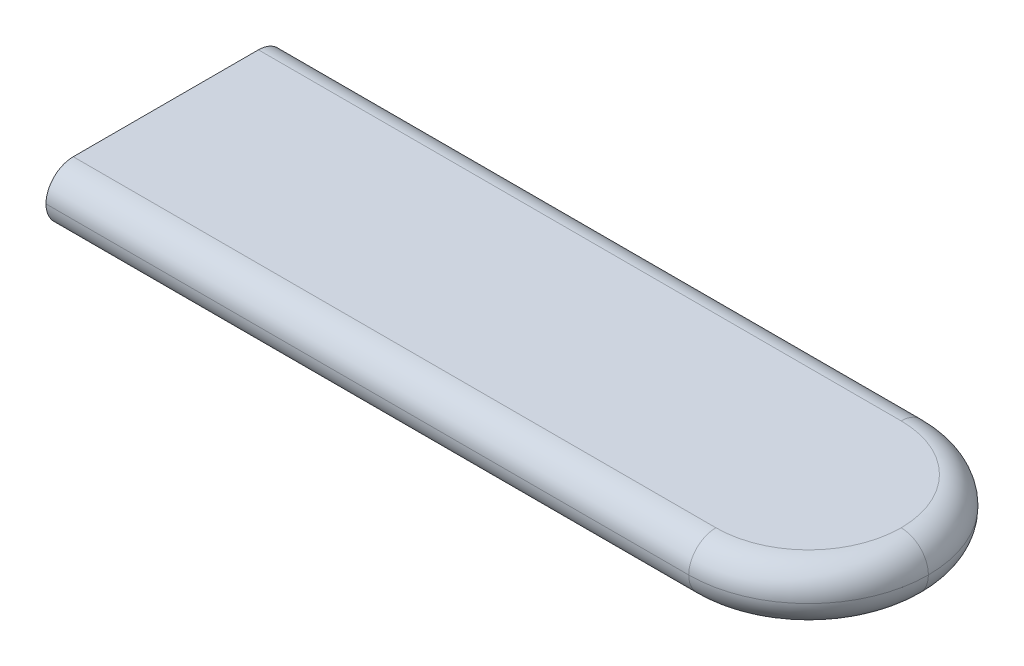
ISO-10303-21;
HEADER;
FILE_DESCRIPTION(('STEP AP214'),'2;1');
FILE_NAME('part.step','',(''),(''),'','','');
FILE_SCHEMA(('AUTOMOTIVE_DESIGN { 1 0 10303 214 1 1 1 1 }'));
ENDSEC;
DATA;
#1=APPLICATION_CONTEXT('core data for automotive mechanical design processes');
#2=APPLICATION_PROTOCOL_DEFINITION('international standard','automotive_design',2000,#1);
#3=PRODUCT_CONTEXT('',#1,'mechanical');
#4=PRODUCT('Part','Part','',(#3));
#5=PRODUCT_RELATED_PRODUCT_CATEGORY('part','',(#4));
#6=PRODUCT_DEFINITION_FORMATION('','',#4);
#7=PRODUCT_DEFINITION_CONTEXT('part definition',#1,'design');
#8=PRODUCT_DEFINITION('design','',#6,#7);
#9=PRODUCT_DEFINITION_SHAPE('','',#8);
#10=(LENGTH_UNIT() NAMED_UNIT(*) SI_UNIT(.MILLI.,.METRE.));
#11=(NAMED_UNIT(*) PLANE_ANGLE_UNIT() SI_UNIT($,.RADIAN.));
#12=(NAMED_UNIT(*) SI_UNIT($,.STERADIAN.) SOLID_ANGLE_UNIT());
#13=UNCERTAINTY_MEASURE_WITH_UNIT(LENGTH_MEASURE(1.E-05),#10,'distance_accuracy_value','');
#14=(GEOMETRIC_REPRESENTATION_CONTEXT(3) GLOBAL_UNCERTAINTY_ASSIGNED_CONTEXT((#13)) GLOBAL_UNIT_ASSIGNED_CONTEXT((#10,
#11,#12)) REPRESENTATION_CONTEXT('',''));
#15=CARTESIAN_POINT('',(0.,0.,0.));
#16=DIRECTION('',(0.,0.,1.));
#17=DIRECTION('',(1.,0.,0.));
#18=AXIS2_PLACEMENT_3D('',#15,#16,#17);
#19=CARTESIAN_POINT('',(40.0930117335328,65.2433443998356,62.6271242589919));
#20=DIRECTION('',(1.,0.,0.));
#21=DIRECTION('',(0.,1.,0.));
#22=AXIS2_PLACEMENT_3D('',#19,#20,#21);
#23=CYLINDRICAL_SURFACE('',#22,2.5);
#24=CARTESIAN_POINT('',(40.0930117335328,65.2433443998356,62.6271242589919));
#25=DIRECTION('',(-1.,0.,0.));
#26=DIRECTION('',(0.,0.,-1.));
#27=AXIS2_PLACEMENT_3D('',#24,#25,#26);
#28=CIRCLE('',#27,2.5);
#29=CARTESIAN_POINT('',(40.0930117335328,62.7433443998355,62.6271242589919));
#30=VERTEX_POINT('',#29);
#31=CARTESIAN_POINT('',(40.0930117335328,65.2433443998356,65.1271242589919));
#32=VERTEX_POINT('',#31);
#33=EDGE_CURVE('E207',#30,#32,#28,.T.);
#34=ORIENTED_EDGE('',*,*,#33,.F.);
#35=DIRECTION('',(-1.,0.,0.));
#36=VECTOR('',#35,1.);
#37=CARTESIAN_POINT('',(99.0930117335328,62.7433443998355,62.6271242589919));
#38=LINE('',#37,#36);
#39=CARTESIAN_POINT('',(99.0930117335328,62.7433443998355,62.6271242589919));
#40=VERTEX_POINT('',#39);
#41=EDGE_CURVE('E265',#40,#30,#38,.T.);
#42=ORIENTED_EDGE('',*,*,#41,.F.);
#43=CARTESIAN_POINT('',(99.0930117335328,65.2433443998356,62.6271242589919));
#44=DIRECTION('',(-1.,0.,0.));
#45=DIRECTION('',(0.,1.,0.));
#46=AXIS2_PLACEMENT_3D('',#43,#44,#45);
#47=CIRCLE('',#46,2.5);
#48=CARTESIAN_POINT('',(99.0930117335328,65.2433443998356,65.1271242589919));
#49=VERTEX_POINT('',#48);
#50=EDGE_CURVE('E322',#40,#49,#47,.T.);
#51=ORIENTED_EDGE('',*,*,#50,.T.);
#52=DIRECTION('',(-1.,0.,0.));
#53=VECTOR('',#52,1.);
#54=CARTESIAN_POINT('',(40.0930117335328,65.2433443998356,65.1271242589919));
#55=LINE('',#54,#53);
#56=EDGE_CURVE('E11',#49,#32,#55,.T.);
#57=ORIENTED_EDGE('',*,*,#56,.T.);
#58=EDGE_LOOP('',(#34,#42,#51,#57));
#59=FACE_BOUND('',#58,.T.);
#60=ADVANCED_FACE('F16',(#59),#23,.T.);
#61=CARTESIAN_POINT('',(99.0930117335328,65.2433443998356,54.1271242589919));
#62=DIRECTION('',(0.,1.,0.));
#63=DIRECTION('',(-1.,0.,0.));
#64=AXIS2_PLACEMENT_3D('',#61,#62,#63);
#65=TOROIDAL_SURFACE('',#64,8.5,2.5);
#66=CARTESIAN_POINT('',(107.593011733533,65.2433443998356,54.1271242589919));
#67=DIRECTION('',(0.,0.,1.));
#68=DIRECTION('',(0.,-1.,0.));
#69=AXIS2_PLACEMENT_3D('',#66,#67,#68);
#70=CIRCLE('',#69,2.5);
#71=CARTESIAN_POINT('',(107.593011733533,62.7433443998355,54.1271242589919));
#72=VERTEX_POINT('',#71);
#73=CARTESIAN_POINT('',(110.093011733533,65.2433443998356,54.1271242589919));
#74=VERTEX_POINT('',#73);
#75=EDGE_CURVE('E311',#72,#74,#70,.T.);
#76=ORIENTED_EDGE('',*,*,#75,.F.);
#77=CARTESIAN_POINT('',(99.0930117335328,62.7433443998355,54.1271242589919));
#78=DIRECTION('',(0.,-1.,0.));
#79=DIRECTION('',(1.,0.,0.));
#80=AXIS2_PLACEMENT_3D('',#77,#78,#79);
#81=CIRCLE('',#80,8.5);
#82=CARTESIAN_POINT('',(99.0930117335328,62.7433443998355,45.6271242589919));
#83=VERTEX_POINT('',#82);
#84=EDGE_CURVE('E262',#83,#72,#81,.T.);
#85=ORIENTED_EDGE('',*,*,#84,.F.);
#86=CARTESIAN_POINT('',(99.0930117335328,65.2433443998356,45.6271242589919));
#87=DIRECTION('',(1.,0.,0.));
#88=DIRECTION('',(0.,-1.,0.));
#89=AXIS2_PLACEMENT_3D('',#86,#87,#88);
#90=CIRCLE('',#89,2.5);
#91=CARTESIAN_POINT('',(99.0930117335328,65.2433443998356,43.127124258992));
#92=VERTEX_POINT('',#91);
#93=EDGE_CURVE('E24',#83,#92,#90,.T.);
#94=ORIENTED_EDGE('',*,*,#93,.T.);
#95=CARTESIAN_POINT('',(99.0930117335328,65.2433443998356,54.1271242589919));
#96=DIRECTION('',(0.,-1.,0.));
#97=DIRECTION('',(1.,0.,0.));
#98=AXIS2_PLACEMENT_3D('',#95,#96,#97);
#99=CIRCLE('',#98,11.);
#100=EDGE_CURVE('E219',#92,#74,#99,.T.);
#101=ORIENTED_EDGE('',*,*,#100,.T.);
#102=EDGE_LOOP('',(#76,#85,#94,#101));
#103=FACE_BOUND('',#102,.T.);
#104=ADVANCED_FACE('F309',(#103),#65,.T.);
#105=CARTESIAN_POINT('',(99.0930117335328,65.2433443998356,62.6271242589919));
#106=DIRECTION('',(-1.,0.,0.));
#107=DIRECTION('',(0.,-1.,0.));
#108=AXIS2_PLACEMENT_3D('',#105,#106,#107);
#109=CYLINDRICAL_SURFACE('',#108,2.5);
#110=DIRECTION('',(1.,0.,0.));
#111=VECTOR('',#110,1.);
#112=CARTESIAN_POINT('',(99.0930117335328,67.7433443998356,62.6271242589919));
#113=LINE('',#112,#111);
#114=CARTESIAN_POINT('',(40.0930117335328,67.7433443998356,62.6271242589919));
#115=VERTEX_POINT('',#114);
#116=CARTESIAN_POINT('',(99.0930117335328,67.7433443998356,62.6271242589919));
#117=VERTEX_POINT('',#116);
#118=EDGE_CURVE('E252',#115,#117,#113,.T.);
#119=ORIENTED_EDGE('',*,*,#118,.F.);
#120=CARTESIAN_POINT('',(40.0930117335328,65.2433443998356,62.6271242589919));
#121=DIRECTION('',(-1.,0.,0.));
#122=DIRECTION('',(0.,0.,-1.));
#123=AXIS2_PLACEMENT_3D('',#120,#121,#122);
#124=CIRCLE('',#123,2.5);
#125=EDGE_CURVE('E212',#32,#115,#124,.T.);
#126=ORIENTED_EDGE('',*,*,#125,.F.);
#127=ORIENTED_EDGE('',*,*,#56,.F.);
#128=CARTESIAN_POINT('',(99.0930117335328,65.2433443998356,62.6271242589919));
#129=DIRECTION('',(-1.,0.,0.));
#130=DIRECTION('',(0.,1.,0.));
#131=AXIS2_PLACEMENT_3D('',#128,#129,#130);
#132=CIRCLE('',#131,2.5);
#133=EDGE_CURVE('E186',#49,#117,#132,.T.);
#134=ORIENTED_EDGE('',*,*,#133,.T.);
#135=EDGE_LOOP('',(#119,#126,#127,#134));
#136=FACE_BOUND('',#135,.T.);
#137=ADVANCED_FACE('F357',(#136),#109,.T.);
#138=CARTESIAN_POINT('',(40.0930117335328,65.2433443998356,45.6271242589919));
#139=DIRECTION('',(-1.,0.,0.));
#140=DIRECTION('',(0.,-1.,0.));
#141=AXIS2_PLACEMENT_3D('',#138,#139,#140);
#142=CYLINDRICAL_SURFACE('',#141,2.5);
#143=CARTESIAN_POINT('',(40.0930117335328,65.2433443998356,45.6271242589919));
#144=DIRECTION('',(-1.,0.,0.));
#145=DIRECTION('',(0.,0.,-1.));
#146=AXIS2_PLACEMENT_3D('',#143,#144,#145);
#147=CIRCLE('',#146,2.5);
#148=CARTESIAN_POINT('',(40.0930117335328,65.2433443998356,43.127124258992));
#149=VERTEX_POINT('',#148);
#150=CARTESIAN_POINT('',(40.0930117335328,62.7433443998355,45.6271242589919));
#151=VERTEX_POINT('',#150);
#152=EDGE_CURVE('E227',#149,#151,#147,.T.);
#153=ORIENTED_EDGE('',*,*,#152,.F.);
#154=DIRECTION('',(1.,0.,0.));
#155=VECTOR('',#154,1.);
#156=CARTESIAN_POINT('',(99.0930117335328,65.2433443998356,43.127124258992));
#157=LINE('',#156,#155);
#158=EDGE_CURVE('E302',#149,#92,#157,.T.);
#159=ORIENTED_EDGE('',*,*,#158,.T.);
#160=ORIENTED_EDGE('',*,*,#93,.F.);
#161=DIRECTION('',(1.,0.,0.));
#162=VECTOR('',#161,1.);
#163=CARTESIAN_POINT('',(99.0930117335328,62.7433443998355,45.6271242589919));
#164=LINE('',#163,#162);
#165=EDGE_CURVE('E268',#151,#83,#164,.T.);
#166=ORIENTED_EDGE('',*,*,#165,.F.);
#167=EDGE_LOOP('',(#153,#159,#160,#166));
#168=FACE_BOUND('',#167,.T.);
#169=ADVANCED_FACE('F365',(#168),#142,.T.);
#170=CARTESIAN_POINT('',(99.0930117335328,65.2433443998356,54.1271242589919));
#171=DIRECTION('',(0.,1.,0.));
#172=DIRECTION('',(-1.,0.,0.));
#173=AXIS2_PLACEMENT_3D('',#170,#171,#172);
#174=TOROIDAL_SURFACE('',#173,8.5,2.5);
#175=CARTESIAN_POINT('',(107.593011733533,65.2433443998356,54.1271242589919));
#176=DIRECTION('',(0.,0.,1.));
#177=DIRECTION('',(0.,-1.,0.));
#178=AXIS2_PLACEMENT_3D('',#175,#176,#177);
#179=CIRCLE('',#178,2.5);
#180=CARTESIAN_POINT('',(107.593011733533,67.7433443998356,54.1271242589919));
#181=VERTEX_POINT('',#180);
#182=EDGE_CURVE('E315',#74,#181,#179,.T.);
#183=ORIENTED_EDGE('',*,*,#182,.F.);
#184=ORIENTED_EDGE('',*,*,#100,.F.);
#185=CARTESIAN_POINT('',(99.0930117335328,65.2433443998356,45.6271242589919));
#186=DIRECTION('',(1.,0.,0.));
#187=DIRECTION('',(0.,-1.,0.));
#188=AXIS2_PLACEMENT_3D('',#185,#186,#187);
#189=CIRCLE('',#188,2.5);
#190=CARTESIAN_POINT('',(99.0930117335328,67.7433443998356,45.6271242589919));
#191=VERTEX_POINT('',#190);
#192=EDGE_CURVE('E299',#92,#191,#189,.T.);
#193=ORIENTED_EDGE('',*,*,#192,.T.);
#194=CARTESIAN_POINT('',(99.0930117335328,67.7433443998356,54.1271242589919));
#195=DIRECTION('',(0.,1.,0.));
#196=DIRECTION('',(1.,0.,0.));
#197=AXIS2_PLACEMENT_3D('',#194,#195,#196);
#198=CIRCLE('',#197,8.5);
#199=EDGE_CURVE('E255',#181,#191,#198,.T.);
#200=ORIENTED_EDGE('',*,*,#199,.F.);
#201=EDGE_LOOP('',(#183,#184,#193,#200));
#202=FACE_BOUND('',#201,.T.);
#203=ADVANCED_FACE('F317',(#202),#174,.T.);
#204=CARTESIAN_POINT('',(99.0930117335328,65.2433443998356,45.6271242589919));
#205=DIRECTION('',(1.,0.,0.));
#206=DIRECTION('',(0.,1.,0.));
#207=AXIS2_PLACEMENT_3D('',#204,#205,#206);
#208=CYLINDRICAL_SURFACE('',#207,2.5);
#209=CARTESIAN_POINT('',(40.0930117335328,65.2433443998356,45.6271242589919));
#210=DIRECTION('',(-1.,0.,0.));
#211=DIRECTION('',(0.,0.,-1.));
#212=AXIS2_PLACEMENT_3D('',#209,#210,#211);
#213=CIRCLE('',#212,2.5);
#214=CARTESIAN_POINT('',(40.0930117335328,67.7433443998356,45.6271242589919));
#215=VERTEX_POINT('',#214);
#216=EDGE_CURVE('E223',#215,#149,#213,.T.);
#217=ORIENTED_EDGE('',*,*,#216,.F.);
#218=DIRECTION('',(-1.,0.,0.));
#219=VECTOR('',#218,1.);
#220=CARTESIAN_POINT('',(40.0930117335328,67.7433443998356,45.6271242589919));
#221=LINE('',#220,#219);
#222=EDGE_CURVE('E259',#191,#215,#221,.T.);
#223=ORIENTED_EDGE('',*,*,#222,.F.);
#224=ORIENTED_EDGE('',*,*,#192,.F.);
#225=ORIENTED_EDGE('',*,*,#158,.F.);
#226=EDGE_LOOP('',(#217,#223,#224,#225));
#227=FACE_BOUND('',#226,.T.);
#228=ADVANCED_FACE('F371',(#227),#208,.T.);
#229=CARTESIAN_POINT('',(99.0930117335328,65.2433443998356,45.6271242589919));
#230=DIRECTION('',(-1.,0.,0.));
#231=DIRECTION('',(0.,-1.,0.));
#232=AXIS2_PLACEMENT_3D('',#229,#230,#231);
#233=CYLINDRICAL_SURFACE('',#232,1.5);
#234=CARTESIAN_POINT('',(99.0930117335328,65.2433443998356,45.6271242589919));
#235=DIRECTION('',(1.,0.,0.));
#236=DIRECTION('',(0.,-1.,0.));
#237=AXIS2_PLACEMENT_3D('',#234,#235,#236);
#238=CIRCLE('',#237,1.5);
#239=CARTESIAN_POINT('',(99.0930117335328,63.7433443998356,45.6271242589919));
#240=VERTEX_POINT('',#239);
#241=CARTESIAN_POINT('',(99.0930117335328,65.2433443998356,44.1271242589919));
#242=VERTEX_POINT('',#241);
#243=EDGE_CURVE('E159',#240,#242,#238,.T.);
#244=ORIENTED_EDGE('',*,*,#243,.T.);
#245=DIRECTION('',(-1.,0.,0.));
#246=VECTOR('',#245,1.);
#247=CARTESIAN_POINT('',(40.0930117335328,65.2433443998356,44.1271242589919));
#248=LINE('',#247,#246);
#249=CARTESIAN_POINT('',(40.0930117335328,65.2433443998356,44.1271242589919));
#250=VERTEX_POINT('',#249);
#251=EDGE_CURVE('E296',#242,#250,#248,.T.);
#252=ORIENTED_EDGE('',*,*,#251,.T.);
#253=CARTESIAN_POINT('',(40.0930117335328,65.2433443998356,45.6271242589919));
#254=DIRECTION('',(1.,0.,0.));
#255=DIRECTION('',(0.,0.,-1.));
#256=AXIS2_PLACEMENT_3D('',#253,#254,#255);
#257=CIRCLE('',#256,1.5);
#258=CARTESIAN_POINT('',(40.0930117335328,63.7433443998356,45.6271242589919));
#259=VERTEX_POINT('',#258);
#260=EDGE_CURVE('E162',#259,#250,#257,.T.);
#261=ORIENTED_EDGE('',*,*,#260,.F.);
#262=DIRECTION('',(-1.,0.,0.));
#263=VECTOR('',#262,1.);
#264=CARTESIAN_POINT('',(99.0930117335328,63.7433443998356,45.6271242589919));
#265=LINE('',#264,#263);
#266=EDGE_CURVE('E156',#240,#259,#265,.T.);
#267=ORIENTED_EDGE('',*,*,#266,.F.);
#268=EDGE_LOOP('',(#244,#252,#261,#267));
#269=FACE_BOUND('',#268,.T.);
#270=ADVANCED_FACE('F158',(#269),#233,.F.);
#271=CARTESIAN_POINT('',(99.0930117335328,65.2433443998356,54.1271242589919));
#272=DIRECTION('',(0.,1.,0.));
#273=DIRECTION('',(-1.,0.,0.));
#274=AXIS2_PLACEMENT_3D('',#271,#272,#273);
#275=TOROIDAL_SURFACE('',#274,8.5,1.5);
#276=CARTESIAN_POINT('',(107.593011733533,65.2433443998356,54.1271242589919));
#277=DIRECTION('',(0.,0.,1.));
#278=DIRECTION('',(0.,-1.,0.));
#279=AXIS2_PLACEMENT_3D('',#276,#277,#278);
#280=CIRCLE('',#279,1.5);
#281=CARTESIAN_POINT('',(107.593011733533,63.7433443998356,54.1271242589919));
#282=VERTEX_POINT('',#281);
#283=CARTESIAN_POINT('',(109.093011733533,65.2433443998356,54.1271242589919));
#284=VERTEX_POINT('',#283);
#285=EDGE_CURVE('E185',#282,#284,#280,.T.);
#286=ORIENTED_EDGE('',*,*,#285,.F.);
#287=CARTESIAN_POINT('',(99.0930117335328,63.7433443998356,54.1271242589919));
#288=DIRECTION('',(0.,1.,0.));
#289=DIRECTION('',(1.,0.,0.));
#290=AXIS2_PLACEMENT_3D('',#287,#288,#289);
#291=CIRCLE('',#290,8.5);
#292=CARTESIAN_POINT('',(99.0930117335328,63.7433443998356,62.6271242589919));
#293=VERTEX_POINT('',#292);
#294=EDGE_CURVE('E169',#293,#282,#291,.T.);
#295=ORIENTED_EDGE('',*,*,#294,.F.);
#296=CARTESIAN_POINT('',(99.0930117335328,65.2433443998356,62.6271242589919));
#297=DIRECTION('',(-1.,0.,0.));
#298=DIRECTION('',(0.,1.,0.));
#299=AXIS2_PLACEMENT_3D('',#296,#297,#298);
#300=CIRCLE('',#299,1.5);
#301=CARTESIAN_POINT('',(99.0930117335328,65.2433443998356,64.1271242589919));
#302=VERTEX_POINT('',#301);
#303=EDGE_CURVE('E44',#293,#302,#300,.T.);
#304=ORIENTED_EDGE('',*,*,#303,.T.);
#305=CARTESIAN_POINT('',(99.0930117335328,65.2433443998356,54.1271242589919));
#306=DIRECTION('',(0.,1.,0.));
#307=DIRECTION('',(1.,0.,0.));
#308=AXIS2_PLACEMENT_3D('',#305,#306,#307);
#309=CIRCLE('',#308,10.);
#310=EDGE_CURVE('E291',#302,#284,#309,.T.);
#311=ORIENTED_EDGE('',*,*,#310,.T.);
#312=EDGE_LOOP('',(#286,#295,#304,#311));
#313=FACE_BOUND('',#312,.T.);
#314=ADVANCED_FACE('F380',(#313),#275,.F.);
#315=CARTESIAN_POINT('',(99.0930117335328,65.2433443998356,45.6271242589919));
#316=DIRECTION('',(1.,0.,0.));
#317=DIRECTION('',(0.,1.,0.));
#318=AXIS2_PLACEMENT_3D('',#315,#316,#317);
#319=CYLINDRICAL_SURFACE('',#318,1.5);
#320=DIRECTION('',(1.,0.,0.));
#321=VECTOR('',#320,1.);
#322=CARTESIAN_POINT('',(99.0930117335328,66.7433443998356,45.6271242589919));
#323=LINE('',#322,#321);
#324=CARTESIAN_POINT('',(40.0930117335328,66.7433443998356,45.6271242589919));
#325=VERTEX_POINT('',#324);
#326=CARTESIAN_POINT('',(99.0930117335328,66.7433443998356,45.6271242589919));
#327=VERTEX_POINT('',#326);
#328=EDGE_CURVE('E274',#325,#327,#323,.T.);
#329=ORIENTED_EDGE('',*,*,#328,.F.);
#330=CARTESIAN_POINT('',(40.0930117335328,65.2433443998356,45.6271242589919));
#331=DIRECTION('',(1.,0.,0.));
#332=DIRECTION('',(0.,0.,-1.));
#333=AXIS2_PLACEMENT_3D('',#330,#331,#332);
#334=CIRCLE('',#333,1.5);
#335=EDGE_CURVE('E233',#250,#325,#334,.T.);
#336=ORIENTED_EDGE('',*,*,#335,.F.);
#337=ORIENTED_EDGE('',*,*,#251,.F.);
#338=CARTESIAN_POINT('',(99.0930117335328,65.2433443998356,45.6271242589919));
#339=DIRECTION('',(1.,0.,0.));
#340=DIRECTION('',(0.,-1.,0.));
#341=AXIS2_PLACEMENT_3D('',#338,#339,#340);
#342=CIRCLE('',#341,1.5);
#343=EDGE_CURVE('E208',#242,#327,#342,.T.);
#344=ORIENTED_EDGE('',*,*,#343,.T.);
#345=EDGE_LOOP('',(#329,#336,#337,#344));
#346=FACE_BOUND('',#345,.T.);
#347=ADVANCED_FACE('F396',(#346),#319,.F.);
#348=CARTESIAN_POINT('',(99.0930117335328,65.2433443998356,62.6271242589919));
#349=DIRECTION('',(1.,0.,0.));
#350=DIRECTION('',(0.,1.,0.));
#351=AXIS2_PLACEMENT_3D('',#348,#349,#350);
#352=CYLINDRICAL_SURFACE('',#351,1.5);
#353=CARTESIAN_POINT('',(40.0930117335328,65.2433443998356,62.6271242589919));
#354=DIRECTION('',(1.,0.,0.));
#355=DIRECTION('',(0.,0.,-1.));
#356=AXIS2_PLACEMENT_3D('',#353,#354,#355);
#357=CIRCLE('',#356,1.5);
#358=CARTESIAN_POINT('',(40.0930117335328,65.2433443998356,64.1271242589919));
#359=VERTEX_POINT('',#358);
#360=CARTESIAN_POINT('',(40.0930117335328,63.7433443998356,62.6271242589919));
#361=VERTEX_POINT('',#360);
#362=EDGE_CURVE('E245',#359,#361,#357,.T.);
#363=ORIENTED_EDGE('',*,*,#362,.F.);
#364=DIRECTION('',(1.,0.,0.));
#365=VECTOR('',#364,1.);
#366=CARTESIAN_POINT('',(99.0930117335328,65.2433443998356,64.1271242589919));
#367=LINE('',#366,#365);
#368=EDGE_CURVE('E287',#359,#302,#367,.T.);
#369=ORIENTED_EDGE('',*,*,#368,.T.);
#370=ORIENTED_EDGE('',*,*,#303,.F.);
#371=DIRECTION('',(1.,0.,0.));
#372=VECTOR('',#371,1.);
#373=CARTESIAN_POINT('',(99.0930117335328,63.7433443998356,62.6271242589919));
#374=LINE('',#373,#372);
#375=EDGE_CURVE('E168',#361,#293,#374,.T.);
#376=ORIENTED_EDGE('',*,*,#375,.F.);
#377=EDGE_LOOP('',(#363,#369,#370,#376));
#378=FACE_BOUND('',#377,.T.);
#379=ADVANCED_FACE('F399',(#378),#352,.F.);
#380=CARTESIAN_POINT('',(99.0930117335328,65.2433443998356,54.1271242589919));
#381=DIRECTION('',(0.,1.,0.));
#382=DIRECTION('',(-1.,0.,0.));
#383=AXIS2_PLACEMENT_3D('',#380,#381,#382);
#384=TOROIDAL_SURFACE('',#383,8.5,1.5);
#385=CARTESIAN_POINT('',(107.593011733533,65.2433443998356,54.1271242589919));
#386=DIRECTION('',(0.,0.,1.));
#387=DIRECTION('',(0.,-1.,0.));
#388=AXIS2_PLACEMENT_3D('',#385,#386,#387);
#389=CIRCLE('',#388,1.5);
#390=CARTESIAN_POINT('',(107.593011733533,66.7433443998356,54.1271242589919));
#391=VERTEX_POINT('',#390);
#392=EDGE_CURVE('E179',#284,#391,#389,.T.);
#393=ORIENTED_EDGE('',*,*,#392,.F.);
#394=ORIENTED_EDGE('',*,*,#310,.F.);
#395=CARTESIAN_POINT('',(99.0930117335328,65.2433443998356,62.6271242589919));
#396=DIRECTION('',(-1.,0.,0.));
#397=DIRECTION('',(0.,1.,0.));
#398=AXIS2_PLACEMENT_3D('',#395,#396,#397);
#399=CIRCLE('',#398,1.5);
#400=CARTESIAN_POINT('',(99.0930117335328,66.7433443998356,62.6271242589919));
#401=VERTEX_POINT('',#400);
#402=EDGE_CURVE('E284',#302,#401,#399,.T.);
#403=ORIENTED_EDGE('',*,*,#402,.T.);
#404=CARTESIAN_POINT('',(99.0930117335328,66.7433443998356,54.1271242589919));
#405=DIRECTION('',(0.,-1.,0.));
#406=DIRECTION('',(1.,0.,0.));
#407=AXIS2_PLACEMENT_3D('',#404,#405,#406);
#408=CIRCLE('',#407,8.5);
#409=EDGE_CURVE('E277',#391,#401,#408,.T.);
#410=ORIENTED_EDGE('',*,*,#409,.F.);
#411=EDGE_LOOP('',(#393,#394,#403,#410));
#412=FACE_BOUND('',#411,.T.);
#413=ADVANCED_FACE('F401',(#412),#384,.F.);
#414=CARTESIAN_POINT('',(99.0930117335328,65.2433443998356,62.6271242589919));
#415=DIRECTION('',(-1.,0.,0.));
#416=DIRECTION('',(0.,-1.,0.));
#417=AXIS2_PLACEMENT_3D('',#414,#415,#416);
#418=CYLINDRICAL_SURFACE('',#417,1.5);
#419=CARTESIAN_POINT('',(40.0930117335328,65.2433443998356,62.6271242589919));
#420=DIRECTION('',(1.,0.,0.));
#421=DIRECTION('',(0.,0.,-1.));
#422=AXIS2_PLACEMENT_3D('',#419,#420,#421);
#423=CIRCLE('',#422,1.5);
#424=CARTESIAN_POINT('',(40.0930117335328,66.7433443998356,62.6271242589919));
#425=VERTEX_POINT('',#424);
#426=EDGE_CURVE('E241',#425,#359,#423,.T.);
#427=ORIENTED_EDGE('',*,*,#426,.F.);
#428=DIRECTION('',(-1.,0.,0.));
#429=VECTOR('',#428,1.);
#430=CARTESIAN_POINT('',(40.0930117335328,66.7433443998356,62.6271242589919));
#431=LINE('',#430,#429);
#432=EDGE_CURVE('E281',#401,#425,#431,.T.);
#433=ORIENTED_EDGE('',*,*,#432,.F.);
#434=ORIENTED_EDGE('',*,*,#402,.F.);
#435=ORIENTED_EDGE('',*,*,#368,.F.);
#436=EDGE_LOOP('',(#427,#433,#434,#435));
#437=FACE_BOUND('',#436,.T.);
#438=ADVANCED_FACE('F404',(#437),#418,.F.);
#439=CARTESIAN_POINT('',(99.0930117335328,66.7433443998356,54.1271242589919));
#440=DIRECTION('',(0.,1.,0.));
#441=DIRECTION('',(1.,0.,0.));
#442=AXIS2_PLACEMENT_3D('',#439,#440,#441);
#443=PLANE('',#442);
#444=DIRECTION('',(0.,0.,1.));
#445=VECTOR('',#444,1.);
#446=CARTESIAN_POINT('',(40.0930117335328,66.7433443998356,44.1271242589919));
#447=LINE('',#446,#445);
#448=EDGE_CURVE('E237',#325,#425,#447,.T.);
#449=ORIENTED_EDGE('',*,*,#448,.F.);
#450=ORIENTED_EDGE('',*,*,#328,.T.);
#451=CARTESIAN_POINT('',(99.0930117335328,66.7433443998356,54.1271242589919));
#452=DIRECTION('',(0.,-1.,0.));
#453=DIRECTION('',(1.,0.,0.));
#454=AXIS2_PLACEMENT_3D('',#451,#452,#453);
#455=CIRCLE('',#454,8.5);
#456=EDGE_CURVE('E202',#327,#391,#455,.T.);
#457=ORIENTED_EDGE('',*,*,#456,.T.);
#458=ORIENTED_EDGE('',*,*,#409,.T.);
#459=ORIENTED_EDGE('',*,*,#432,.T.);
#460=EDGE_LOOP('',(#449,#450,#457,#458,#459));
#461=FACE_BOUND('',#460,.T.);
#462=ADVANCED_FACE('F406',(#461),#443,.F.);
#463=CARTESIAN_POINT('',(99.0930117335328,63.7433443998356,54.1271242589919));
#464=DIRECTION('',(0.,1.,0.));
#465=DIRECTION('',(1.,0.,0.));
#466=AXIS2_PLACEMENT_3D('',#463,#464,#465);
#467=PLANE('',#466);
#468=ORIENTED_EDGE('',*,*,#294,.T.);
#469=CARTESIAN_POINT('',(99.0930117335328,63.7433443998356,54.1271242589919));
#470=DIRECTION('',(0.,1.,0.));
#471=DIRECTION('',(1.,0.,0.));
#472=AXIS2_PLACEMENT_3D('',#469,#470,#471);
#473=CIRCLE('',#472,8.5);
#474=EDGE_CURVE('E175',#282,#240,#473,.T.);
#475=ORIENTED_EDGE('',*,*,#474,.T.);
#476=ORIENTED_EDGE('',*,*,#266,.T.);
#477=DIRECTION('',(0.,0.,1.));
#478=VECTOR('',#477,1.);
#479=CARTESIAN_POINT('',(40.0930117335328,63.7433443998356,44.1271242589919));
#480=LINE('',#479,#478);
#481=EDGE_CURVE('E249',#259,#361,#480,.T.);
#482=ORIENTED_EDGE('',*,*,#481,.T.);
#483=ORIENTED_EDGE('',*,*,#375,.T.);
#484=EDGE_LOOP('',(#468,#475,#476,#482,#483));
#485=FACE_BOUND('',#484,.T.);
#486=ADVANCED_FACE('F181',(#485),#467,.T.);
#487=CARTESIAN_POINT('',(99.0930117335328,62.7433443998355,54.1271242589919));
#488=DIRECTION('',(0.,1.,0.));
#489=DIRECTION('',(1.,0.,0.));
#490=AXIS2_PLACEMENT_3D('',#487,#488,#489);
#491=PLANE('',#490);
#492=ORIENTED_EDGE('',*,*,#84,.T.);
#493=CARTESIAN_POINT('',(99.0930117335328,62.7433443998355,54.1271242589919));
#494=DIRECTION('',(0.,-1.,0.));
#495=DIRECTION('',(1.,0.,0.));
#496=AXIS2_PLACEMENT_3D('',#493,#494,#495);
#497=CIRCLE('',#496,8.5);
#498=EDGE_CURVE('E335',#72,#40,#497,.T.);
#499=ORIENTED_EDGE('',*,*,#498,.T.);
#500=ORIENTED_EDGE('',*,*,#41,.T.);
#501=DIRECTION('',(0.,0.,1.));
#502=VECTOR('',#501,1.);
#503=CARTESIAN_POINT('',(40.0930117335328,62.7433443998355,44.1271242589919));
#504=LINE('',#503,#502);
#505=EDGE_CURVE('E203',#151,#30,#504,.T.);
#506=ORIENTED_EDGE('',*,*,#505,.F.);
#507=ORIENTED_EDGE('',*,*,#165,.T.);
#508=EDGE_LOOP('',(#492,#499,#500,#506,#507));
#509=FACE_BOUND('',#508,.T.);
#510=ADVANCED_FACE('F361',(#509),#491,.F.);
#511=CARTESIAN_POINT('',(99.0930117335328,67.7433443998356,54.1271242589919));
#512=DIRECTION('',(0.,1.,0.));
#513=DIRECTION('',(1.,0.,0.));
#514=AXIS2_PLACEMENT_3D('',#511,#512,#513);
#515=PLANE('',#514);
#516=DIRECTION('',(0.,0.,1.));
#517=VECTOR('',#516,1.);
#518=CARTESIAN_POINT('',(40.0930117335328,67.7433443998356,43.127124258992));
#519=LINE('',#518,#517);
#520=EDGE_CURVE('E216',#215,#115,#519,.T.);
#521=ORIENTED_EDGE('',*,*,#520,.T.);
#522=ORIENTED_EDGE('',*,*,#118,.T.);
#523=CARTESIAN_POINT('',(99.0930117335328,67.7433443998356,54.1271242589919));
#524=DIRECTION('',(0.,1.,0.));
#525=DIRECTION('',(1.,0.,0.));
#526=AXIS2_PLACEMENT_3D('',#523,#524,#525);
#527=CIRCLE('',#526,8.5);
#528=EDGE_CURVE('E193',#117,#181,#527,.T.);
#529=ORIENTED_EDGE('',*,*,#528,.T.);
#530=ORIENTED_EDGE('',*,*,#199,.T.);
#531=ORIENTED_EDGE('',*,*,#222,.T.);
#532=EDGE_LOOP('',(#521,#522,#529,#530,#531));
#533=FACE_BOUND('',#532,.T.);
#534=ADVANCED_FACE('F353',(#533),#515,.T.);
#535=CARTESIAN_POINT('',(40.0930117335328,67.7433443998356,44.1271242589919));
#536=DIRECTION('',(1.,0.,0.));
#537=DIRECTION('',(0.,0.,-1.));
#538=AXIS2_PLACEMENT_3D('',#535,#536,#537);
#539=PLANE('',#538);
#540=ORIENTED_EDGE('',*,*,#260,.T.);
#541=ORIENTED_EDGE('',*,*,#335,.T.);
#542=ORIENTED_EDGE('',*,*,#448,.T.);
#543=ORIENTED_EDGE('',*,*,#426,.T.);
#544=ORIENTED_EDGE('',*,*,#362,.T.);
#545=ORIENTED_EDGE('',*,*,#481,.F.);
#546=EDGE_LOOP('',(#540,#541,#542,#543,#544,#545));
#547=FACE_BOUND('',#546,.T.);
#548=ORIENTED_EDGE('',*,*,#505,.T.);
#549=ORIENTED_EDGE('',*,*,#33,.T.);
#550=ORIENTED_EDGE('',*,*,#125,.T.);
#551=ORIENTED_EDGE('',*,*,#520,.F.);
#552=ORIENTED_EDGE('',*,*,#216,.T.);
#553=ORIENTED_EDGE('',*,*,#152,.T.);
#554=EDGE_LOOP('',(#548,#549,#550,#551,#552,#553));
#555=FACE_BOUND('',#554,.T.);
#556=ADVANCED_FACE('F367',(#547,#555),#539,.F.);
#557=CARTESIAN_POINT('',(99.0930117335328,65.2433443998356,54.1271242589919));
#558=DIRECTION('',(0.,1.,0.));
#559=DIRECTION('',(-1.,0.,0.));
#560=AXIS2_PLACEMENT_3D('',#557,#558,#559);
#561=TOROIDAL_SURFACE('',#560,8.5,1.5);
#562=CARTESIAN_POINT('',(99.0930117335328,65.2433443998356,54.1271242589919));
#563=DIRECTION('',(0.,1.,0.));
#564=DIRECTION('',(1.,0.,0.));
#565=AXIS2_PLACEMENT_3D('',#562,#563,#564);
#566=CIRCLE('',#565,10.);
#567=EDGE_CURVE('E177',#284,#242,#566,.T.);
#568=ORIENTED_EDGE('',*,*,#567,.F.);
#569=ORIENTED_EDGE('',*,*,#392,.T.);
#570=ORIENTED_EDGE('',*,*,#456,.F.);
#571=ORIENTED_EDGE('',*,*,#343,.F.);
#572=EDGE_LOOP('',(#568,#569,#570,#571));
#573=FACE_BOUND('',#572,.T.);
#574=ADVANCED_FACE('F421',(#573),#561,.F.);
#575=CARTESIAN_POINT('',(99.0930117335328,65.2433443998356,54.1271242589919));
#576=DIRECTION('',(0.,1.,0.));
#577=DIRECTION('',(-1.,0.,0.));
#578=AXIS2_PLACEMENT_3D('',#575,#576,#577);
#579=TOROIDAL_SURFACE('',#578,8.5,1.5);
#580=ORIENTED_EDGE('',*,*,#474,.F.);
#581=ORIENTED_EDGE('',*,*,#285,.T.);
#582=ORIENTED_EDGE('',*,*,#567,.T.);
#583=ORIENTED_EDGE('',*,*,#243,.F.);
#584=EDGE_LOOP('',(#580,#581,#582,#583));
#585=FACE_BOUND('',#584,.T.);
#586=ADVANCED_FACE('F173',(#585),#579,.F.);
#587=CARTESIAN_POINT('',(99.0930117335328,65.2433443998356,54.1271242589919));
#588=DIRECTION('',(0.,1.,0.));
#589=DIRECTION('',(-1.,0.,0.));
#590=AXIS2_PLACEMENT_3D('',#587,#588,#589);
#591=TOROIDAL_SURFACE('',#590,8.5,2.5);
#592=CARTESIAN_POINT('',(99.0930117335328,65.2433443998356,54.1271242589919));
#593=DIRECTION('',(0.,-1.,0.));
#594=DIRECTION('',(1.,0.,0.));
#595=AXIS2_PLACEMENT_3D('',#592,#593,#594);
#596=CIRCLE('',#595,11.);
#597=EDGE_CURVE('E326',#74,#49,#596,.T.);
#598=ORIENTED_EDGE('',*,*,#597,.F.);
#599=ORIENTED_EDGE('',*,*,#182,.T.);
#600=ORIENTED_EDGE('',*,*,#528,.F.);
#601=ORIENTED_EDGE('',*,*,#133,.F.);
#602=EDGE_LOOP('',(#598,#599,#600,#601));
#603=FACE_BOUND('',#602,.T.);
#604=ADVANCED_FACE('F327',(#603),#591,.T.);
#605=CARTESIAN_POINT('',(99.0930117335328,65.2433443998356,54.1271242589919));
#606=DIRECTION('',(0.,1.,0.));
#607=DIRECTION('',(-1.,0.,0.));
#608=AXIS2_PLACEMENT_3D('',#605,#606,#607);
#609=TOROIDAL_SURFACE('',#608,8.5,2.5);
#610=ORIENTED_EDGE('',*,*,#498,.F.);
#611=ORIENTED_EDGE('',*,*,#75,.T.);
#612=ORIENTED_EDGE('',*,*,#597,.T.);
#613=ORIENTED_EDGE('',*,*,#50,.F.);
#614=EDGE_LOOP('',(#610,#611,#612,#613));
#615=FACE_BOUND('',#614,.T.);
#616=ADVANCED_FACE('F333',(#615),#609,.T.);
#617=CLOSED_SHELL('',(#60,#104,#137,#169,#203,#228,#270,#314,#347,#379,#413,#438,#462,#486,#510,
#534,#556,#574,#586,#604,#616));
#618=MANIFOLD_SOLID_BREP('B1',#617);
#619=ADVANCED_BREP_SHAPE_REPRESENTATION('',(#18,#618),#14);
#620=SHAPE_DEFINITION_REPRESENTATION(#9,#619);
ENDSEC;
END-ISO-10303-21;
